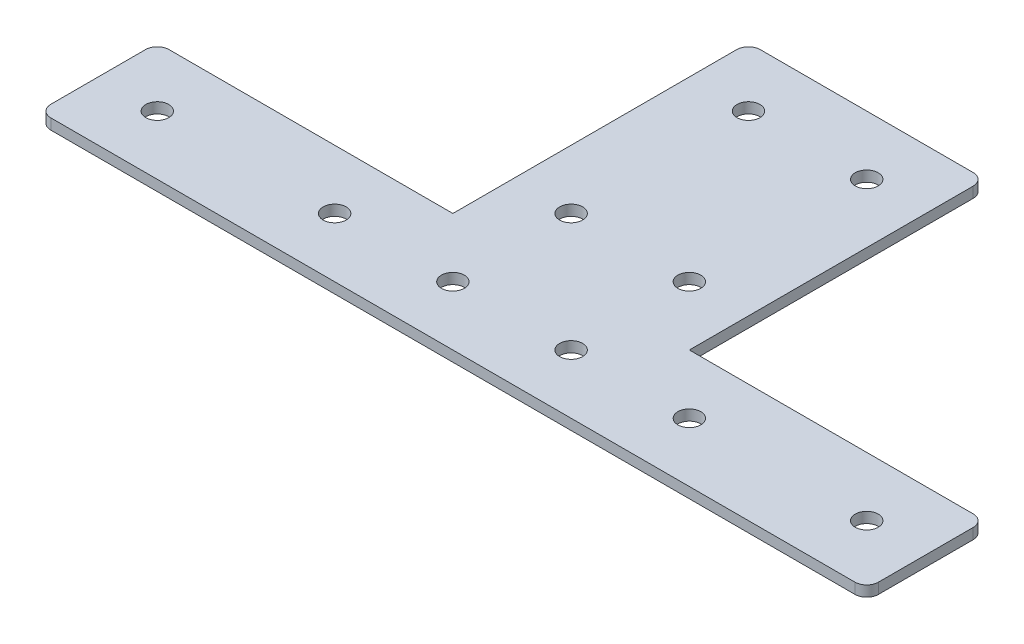
ISO-10303-21;
HEADER;
FILE_DESCRIPTION(('STEP AP214'),'2;1');
FILE_NAME('part.step','',(''),(''),'','','');
FILE_SCHEMA(('AUTOMOTIVE_DESIGN { 1 0 10303 214 1 1 1 1 }'));
ENDSEC;
DATA;
#1=APPLICATION_CONTEXT('core data for automotive mechanical design processes');
#2=APPLICATION_PROTOCOL_DEFINITION('international standard','automotive_design',2000,#1);
#3=PRODUCT_CONTEXT('',#1,'mechanical');
#4=PRODUCT('Part','Part','',(#3));
#5=PRODUCT_RELATED_PRODUCT_CATEGORY('part','',(#4));
#6=PRODUCT_DEFINITION_FORMATION('','',#4);
#7=PRODUCT_DEFINITION_CONTEXT('part definition',#1,'design');
#8=PRODUCT_DEFINITION('design','',#6,#7);
#9=PRODUCT_DEFINITION_SHAPE('','',#8);
#10=(LENGTH_UNIT() NAMED_UNIT(*) SI_UNIT(.MILLI.,.METRE.));
#11=(NAMED_UNIT(*) PLANE_ANGLE_UNIT() SI_UNIT($,.RADIAN.));
#12=(NAMED_UNIT(*) SI_UNIT($,.STERADIAN.) SOLID_ANGLE_UNIT());
#13=UNCERTAINTY_MEASURE_WITH_UNIT(LENGTH_MEASURE(1.E-05),#10,'distance_accuracy_value','');
#14=(GEOMETRIC_REPRESENTATION_CONTEXT(3) GLOBAL_UNCERTAINTY_ASSIGNED_CONTEXT((#13)) GLOBAL_UNIT_ASSIGNED_CONTEXT((#10,
#11,#12)) REPRESENTATION_CONTEXT('',''));
#15=CARTESIAN_POINT('',(0.,0.,0.));
#16=DIRECTION('',(0.,0.,1.));
#17=DIRECTION('',(1.,0.,0.));
#18=AXIS2_PLACEMENT_3D('',#15,#16,#17);
#19=CARTESIAN_POINT('',(0.,2.286,0.));
#20=DIRECTION('',(0.,0.,-1.));
#21=DIRECTION('',(-1.,0.,0.));
#22=AXIS2_PLACEMENT_3D('',#19,#20,#21);
#23=PLANE('',#22);
#24=DIRECTION('',(1.,0.,0.));
#25=VECTOR('',#24,1.);
#26=CARTESIAN_POINT('',(0.,0.,0.));
#27=LINE('',#26,#25);
#28=CARTESIAN_POINT('',(-86.36,0.,0.));
#29=VERTEX_POINT('',#28);
#30=CARTESIAN_POINT('',(86.36,0.,0.));
#31=VERTEX_POINT('',#30);
#32=EDGE_CURVE('E204',#29,#31,#27,.T.);
#33=ORIENTED_EDGE('',*,*,#32,.T.);
#34=DIRECTION('',(0.,-1.,0.));
#35=VECTOR('',#34,1.);
#36=CARTESIAN_POINT('',(86.36,2.286,0.));
#37=LINE('',#36,#35);
#38=CARTESIAN_POINT('',(86.36,2.286,0.));
#39=VERTEX_POINT('',#38);
#40=EDGE_CURVE('E53',#31,#39,#37,.F.);
#41=ORIENTED_EDGE('',*,*,#40,.T.);
#42=DIRECTION('',(1.,0.,0.));
#43=VECTOR('',#42,1.);
#44=CARTESIAN_POINT('',(0.,2.286,0.));
#45=LINE('',#44,#43);
#46=CARTESIAN_POINT('',(-86.36,2.286,0.));
#47=VERTEX_POINT('',#46);
#48=EDGE_CURVE('E207',#47,#39,#45,.T.);
#49=ORIENTED_EDGE('',*,*,#48,.F.);
#50=DIRECTION('',(0.,-1.,0.));
#51=VECTOR('',#50,1.);
#52=CARTESIAN_POINT('',(-86.36,0.,0.));
#53=LINE('',#52,#51);
#54=EDGE_CURVE('E262',#47,#29,#53,.T.);
#55=ORIENTED_EDGE('',*,*,#54,.T.);
#56=EDGE_LOOP('',(#33,#41,#49,#55));
#57=FACE_BOUND('',#56,.T.);
#58=ADVANCED_FACE('F32',(#57),#23,.F.);
#59=CARTESIAN_POINT('',(88.9,2.286,0.));
#60=DIRECTION('',(-1.,0.,0.));
#61=DIRECTION('',(0.,0.,1.));
#62=AXIS2_PLACEMENT_3D('',#59,#60,#61);
#63=PLANE('',#62);
#64=DIRECTION('',(0.,0.,-1.));
#65=VECTOR('',#64,1.);
#66=CARTESIAN_POINT('',(88.9,0.,0.));
#67=LINE('',#66,#65);
#68=CARTESIAN_POINT('',(88.9,0.,-2.54));
#69=VERTEX_POINT('',#68);
#70=CARTESIAN_POINT('',(88.9,0.,-22.86));
#71=VERTEX_POINT('',#70);
#72=EDGE_CURVE('E220',#69,#71,#67,.T.);
#73=ORIENTED_EDGE('',*,*,#72,.T.);
#74=DIRECTION('',(0.,-1.,0.));
#75=VECTOR('',#74,1.);
#76=CARTESIAN_POINT('',(88.9,2.286,-22.86));
#77=LINE('',#76,#75);
#78=CARTESIAN_POINT('',(88.9,2.286,-22.86));
#79=VERTEX_POINT('',#78);
#80=EDGE_CURVE('E249',#71,#79,#77,.F.);
#81=ORIENTED_EDGE('',*,*,#80,.T.);
#82=DIRECTION('',(0.,0.,-1.));
#83=VECTOR('',#82,1.);
#84=CARTESIAN_POINT('',(88.9,2.286,0.));
#85=LINE('',#84,#83);
#86=CARTESIAN_POINT('',(88.9,2.286,-2.54));
#87=VERTEX_POINT('',#86);
#88=EDGE_CURVE('E209',#87,#79,#85,.T.);
#89=ORIENTED_EDGE('',*,*,#88,.F.);
#90=DIRECTION('',(0.,-1.,0.));
#91=VECTOR('',#90,1.);
#92=CARTESIAN_POINT('',(88.9,2.286,-2.54));
#93=LINE('',#92,#91);
#94=EDGE_CURVE('E246',#87,#69,#93,.T.);
#95=ORIENTED_EDGE('',*,*,#94,.T.);
#96=EDGE_LOOP('',(#73,#81,#89,#95));
#97=FACE_BOUND('',#96,.T.);
#98=ADVANCED_FACE('F308',(#97),#63,.F.);
#99=CARTESIAN_POINT('',(25.4,2.286,-25.4));
#100=DIRECTION('',(0.,0.,1.));
#101=DIRECTION('',(1.,0.,0.));
#102=AXIS2_PLACEMENT_3D('',#99,#100,#101);
#103=PLANE('',#102);
#104=DIRECTION('',(-1.,0.,0.));
#105=VECTOR('',#104,1.);
#106=CARTESIAN_POINT('',(25.4,2.286,-25.4));
#107=LINE('',#106,#105);
#108=CARTESIAN_POINT('',(86.36,2.286,-25.4));
#109=VERTEX_POINT('',#108);
#110=CARTESIAN_POINT('',(25.4,2.286,-25.4));
#111=VERTEX_POINT('',#110);
#112=EDGE_CURVE('E212',#109,#111,#107,.T.);
#113=ORIENTED_EDGE('',*,*,#112,.F.);
#114=DIRECTION('',(0.,-1.,0.));
#115=VECTOR('',#114,1.);
#116=CARTESIAN_POINT('',(86.36,2.286,-25.4));
#117=LINE('',#116,#115);
#118=CARTESIAN_POINT('',(86.36,0.,-25.4));
#119=VERTEX_POINT('',#118);
#120=EDGE_CURVE('E231',#109,#119,#117,.T.);
#121=ORIENTED_EDGE('',*,*,#120,.T.);
#122=DIRECTION('',(-1.,0.,0.));
#123=VECTOR('',#122,1.);
#124=CARTESIAN_POINT('',(25.4,0.,-25.4));
#125=LINE('',#124,#123);
#126=CARTESIAN_POINT('',(25.4,0.,-25.4));
#127=VERTEX_POINT('',#126);
#128=EDGE_CURVE('E223',#119,#127,#125,.T.);
#129=ORIENTED_EDGE('',*,*,#128,.T.);
#130=DIRECTION('',(0.,-1.,0.));
#131=VECTOR('',#130,1.);
#132=CARTESIAN_POINT('',(25.4,2.286,-25.4));
#133=LINE('',#132,#131);
#134=EDGE_CURVE('E218',#111,#127,#133,.T.);
#135=ORIENTED_EDGE('',*,*,#134,.F.);
#136=EDGE_LOOP('',(#113,#121,#129,#135));
#137=FACE_BOUND('',#136,.T.);
#138=ADVANCED_FACE('F316',(#137),#103,.F.);
#139=CARTESIAN_POINT('',(25.4,2.286,-25.4));
#140=DIRECTION('',(-1.,0.,0.));
#141=DIRECTION('',(0.,0.,1.));
#142=AXIS2_PLACEMENT_3D('',#139,#140,#141);
#143=PLANE('',#142);
#144=DIRECTION('',(0.,0.,-1.));
#145=VECTOR('',#144,1.);
#146=CARTESIAN_POINT('',(25.4,0.,-25.4));
#147=LINE('',#146,#145);
#148=CARTESIAN_POINT('',(25.4,0.,-86.36));
#149=VERTEX_POINT('',#148);
#150=EDGE_CURVE('E225',#127,#149,#147,.T.);
#151=ORIENTED_EDGE('',*,*,#150,.T.);
#152=DIRECTION('',(0.,-1.,0.));
#153=VECTOR('',#152,1.);
#154=CARTESIAN_POINT('',(25.4,2.286,-86.36));
#155=LINE('',#154,#153);
#156=CARTESIAN_POINT('',(25.4,2.286,-86.36));
#157=VERTEX_POINT('',#156);
#158=EDGE_CURVE('E11',#149,#157,#155,.F.);
#159=ORIENTED_EDGE('',*,*,#158,.T.);
#160=DIRECTION('',(0.,0.,-1.));
#161=VECTOR('',#160,1.);
#162=CARTESIAN_POINT('',(25.4,2.286,-25.4));
#163=LINE('',#162,#161);
#164=EDGE_CURVE('E214',#111,#157,#163,.T.);
#165=ORIENTED_EDGE('',*,*,#164,.F.);
#166=ORIENTED_EDGE('',*,*,#134,.T.);
#167=EDGE_LOOP('',(#151,#159,#165,#166));
#168=FACE_BOUND('',#167,.T.);
#169=ADVANCED_FACE('F319',(#168),#143,.F.);
#170=CARTESIAN_POINT('',(0.,2.286,-88.9));
#171=DIRECTION('',(0.,0.,1.));
#172=DIRECTION('',(1.,0.,0.));
#173=AXIS2_PLACEMENT_3D('',#170,#171,#172);
#174=PLANE('',#173);
#175=DIRECTION('',(-1.,0.,0.));
#176=VECTOR('',#175,1.);
#177=CARTESIAN_POINT('',(0.,0.,-88.9));
#178=LINE('',#177,#176);
#179=CARTESIAN_POINT('',(22.86,0.,-88.9));
#180=VERTEX_POINT('',#179);
#181=CARTESIAN_POINT('',(-22.86,0.,-88.9));
#182=VERTEX_POINT('',#181);
#183=EDGE_CURVE('E210',#180,#182,#178,.T.);
#184=ORIENTED_EDGE('',*,*,#183,.T.);
#185=DIRECTION('',(0.,-1.,0.));
#186=VECTOR('',#185,1.);
#187=CARTESIAN_POINT('',(-22.86,2.286,-88.9));
#188=LINE('',#187,#186);
#189=CARTESIAN_POINT('',(-22.86,2.286,-88.9));
#190=VERTEX_POINT('',#189);
#191=EDGE_CURVE('E40',#182,#190,#188,.F.);
#192=ORIENTED_EDGE('',*,*,#191,.T.);
#193=DIRECTION('',(-1.,0.,0.));
#194=VECTOR('',#193,1.);
#195=CARTESIAN_POINT('',(0.,2.286,-88.9));
#196=LINE('',#195,#194);
#197=CARTESIAN_POINT('',(22.86,2.286,-88.9));
#198=VERTEX_POINT('',#197);
#199=EDGE_CURVE('E216',#198,#190,#196,.T.);
#200=ORIENTED_EDGE('',*,*,#199,.F.);
#201=DIRECTION('',(0.,-1.,0.));
#202=VECTOR('',#201,1.);
#203=CARTESIAN_POINT('',(22.86,2.286,-88.9));
#204=LINE('',#203,#202);
#205=EDGE_CURVE('E274',#198,#180,#204,.T.);
#206=ORIENTED_EDGE('',*,*,#205,.T.);
#207=EDGE_LOOP('',(#184,#192,#200,#206));
#208=FACE_BOUND('',#207,.T.);
#209=ADVANCED_FACE('F279',(#208),#174,.F.);
#210=CARTESIAN_POINT('',(0.,2.286,0.));
#211=DIRECTION('',(0.,1.,0.));
#212=DIRECTION('',(0.,0.,1.));
#213=AXIS2_PLACEMENT_3D('',#210,#211,#212);
#214=PLANE('',#213);
#215=CARTESIAN_POINT('',(-38.1,2.286,-12.7));
#216=DIRECTION('',(0.,-1.,0.));
#217=DIRECTION('',(0.,0.,1.));
#218=AXIS2_PLACEMENT_3D('',#215,#216,#217);
#219=CIRCLE('',#218,2.4638);
#220=CARTESIAN_POINT('',(-38.1,2.286,-10.2362));
#221=VERTEX_POINT('',#220);
#222=EDGE_CURVE('E589',#221,#221,#219,.T.);
#223=ORIENTED_EDGE('',*,*,#222,.T.);
#224=EDGE_LOOP('',(#223));
#225=FACE_BOUND('',#224,.T.);
#226=CARTESIAN_POINT('',(-12.7,2.286,-38.1));
#227=DIRECTION('',(0.,-1.,0.));
#228=DIRECTION('',(0.,0.,1.));
#229=AXIS2_PLACEMENT_3D('',#226,#227,#228);
#230=CIRCLE('',#229,2.4638);
#231=CARTESIAN_POINT('',(-12.7,2.286,-35.6362));
#232=VERTEX_POINT('',#231);
#233=EDGE_CURVE('E593',#232,#232,#230,.T.);
#234=ORIENTED_EDGE('',*,*,#233,.T.);
#235=EDGE_LOOP('',(#234));
#236=FACE_BOUND('',#235,.T.);
#237=CARTESIAN_POINT('',(-12.7,2.286,-76.2));
#238=DIRECTION('',(0.,-1.,0.));
#239=DIRECTION('',(0.,0.,1.));
#240=AXIS2_PLACEMENT_3D('',#237,#238,#239);
#241=CIRCLE('',#240,2.4638);
#242=CARTESIAN_POINT('',(-12.7,2.286,-73.7362));
#243=VERTEX_POINT('',#242);
#244=EDGE_CURVE('E597',#243,#243,#241,.T.);
#245=ORIENTED_EDGE('',*,*,#244,.T.);
#246=EDGE_LOOP('',(#245));
#247=FACE_BOUND('',#246,.T.);
#248=CARTESIAN_POINT('',(-12.7,2.286,-12.7));
#249=DIRECTION('',(0.,-1.,0.));
#250=DIRECTION('',(0.,0.,1.));
#251=AXIS2_PLACEMENT_3D('',#248,#249,#250);
#252=CIRCLE('',#251,2.4638);
#253=CARTESIAN_POINT('',(-12.7,2.286,-10.2362));
#254=VERTEX_POINT('',#253);
#255=EDGE_CURVE('E601',#254,#254,#252,.T.);
#256=ORIENTED_EDGE('',*,*,#255,.T.);
#257=EDGE_LOOP('',(#256));
#258=FACE_BOUND('',#257,.T.);
#259=CARTESIAN_POINT('',(-76.2,2.286,-12.7));
#260=DIRECTION('',(0.,-1.,0.));
#261=DIRECTION('',(0.,0.,1.));
#262=AXIS2_PLACEMENT_3D('',#259,#260,#261);
#263=CIRCLE('',#262,2.4638);
#264=CARTESIAN_POINT('',(-76.2,2.286,-10.2362));
#265=VERTEX_POINT('',#264);
#266=EDGE_CURVE('E169',#265,#265,#263,.T.);
#267=ORIENTED_EDGE('',*,*,#266,.T.);
#268=EDGE_LOOP('',(#267));
#269=FACE_BOUND('',#268,.T.);
#270=CARTESIAN_POINT('',(38.1,2.286,-12.7));
#271=DIRECTION('',(0.,1.,0.));
#272=DIRECTION('',(0.,0.,1.));
#273=AXIS2_PLACEMENT_3D('',#270,#271,#272);
#274=CIRCLE('',#273,2.4638);
#275=CARTESIAN_POINT('',(38.1,2.286,-10.2362));
#276=VERTEX_POINT('',#275);
#277=EDGE_CURVE('E156',#276,#276,#274,.T.);
#278=ORIENTED_EDGE('',*,*,#277,.F.);
#279=EDGE_LOOP('',(#278));
#280=FACE_BOUND('',#279,.T.);
#281=CARTESIAN_POINT('',(12.7,2.286,-38.1));
#282=DIRECTION('',(0.,1.,0.));
#283=DIRECTION('',(0.,0.,1.));
#284=AXIS2_PLACEMENT_3D('',#281,#282,#283);
#285=CIRCLE('',#284,2.4638);
#286=CARTESIAN_POINT('',(12.7,2.286,-35.6362));
#287=VERTEX_POINT('',#286);
#288=EDGE_CURVE('E181',#287,#287,#285,.T.);
#289=ORIENTED_EDGE('',*,*,#288,.F.);
#290=EDGE_LOOP('',(#289));
#291=FACE_BOUND('',#290,.T.);
#292=CARTESIAN_POINT('',(12.7,2.286,-76.2));
#293=DIRECTION('',(0.,1.,0.));
#294=DIRECTION('',(0.,0.,1.));
#295=AXIS2_PLACEMENT_3D('',#292,#293,#294);
#296=CIRCLE('',#295,2.4638);
#297=CARTESIAN_POINT('',(12.7,2.286,-73.7362));
#298=VERTEX_POINT('',#297);
#299=EDGE_CURVE('E180',#298,#298,#296,.T.);
#300=ORIENTED_EDGE('',*,*,#299,.F.);
#301=EDGE_LOOP('',(#300));
#302=FACE_BOUND('',#301,.T.);
#303=CARTESIAN_POINT('',(12.7,2.286,-12.7));
#304=DIRECTION('',(0.,1.,0.));
#305=DIRECTION('',(0.,0.,1.));
#306=AXIS2_PLACEMENT_3D('',#303,#304,#305);
#307=CIRCLE('',#306,2.4638);
#308=CARTESIAN_POINT('',(12.7,2.286,-10.2362));
#309=VERTEX_POINT('',#308);
#310=EDGE_CURVE('E193',#309,#309,#307,.T.);
#311=ORIENTED_EDGE('',*,*,#310,.F.);
#312=EDGE_LOOP('',(#311));
#313=FACE_BOUND('',#312,.T.);
#314=CARTESIAN_POINT('',(76.2,2.286,-12.7));
#315=DIRECTION('',(0.,1.,0.));
#316=DIRECTION('',(0.,0.,1.));
#317=AXIS2_PLACEMENT_3D('',#314,#315,#316);
#318=CIRCLE('',#317,2.4638);
#319=CARTESIAN_POINT('',(76.2,2.286,-10.2362));
#320=VERTEX_POINT('',#319);
#321=EDGE_CURVE('E192',#320,#320,#318,.T.);
#322=ORIENTED_EDGE('',*,*,#321,.F.);
#323=EDGE_LOOP('',(#322));
#324=FACE_BOUND('',#323,.T.);
#325=ORIENTED_EDGE('',*,*,#88,.T.);
#326=CARTESIAN_POINT('',(86.36,2.286,-22.86));
#327=DIRECTION('',(0.,1.,0.));
#328=DIRECTION('',(0.,0.,1.));
#329=AXIS2_PLACEMENT_3D('',#326,#327,#328);
#330=CIRCLE('',#329,2.54);
#331=EDGE_CURVE('E260',#79,#109,#330,.T.);
#332=ORIENTED_EDGE('',*,*,#331,.T.);
#333=ORIENTED_EDGE('',*,*,#112,.T.);
#334=ORIENTED_EDGE('',*,*,#164,.T.);
#335=CARTESIAN_POINT('',(22.86,2.286,-86.36));
#336=DIRECTION('',(0.,1.,0.));
#337=DIRECTION('',(0.,0.,1.));
#338=AXIS2_PLACEMENT_3D('',#335,#336,#337);
#339=CIRCLE('',#338,2.54);
#340=EDGE_CURVE('E251',#157,#198,#339,.T.);
#341=ORIENTED_EDGE('',*,*,#340,.T.);
#342=ORIENTED_EDGE('',*,*,#199,.T.);
#343=CARTESIAN_POINT('',(-22.86,2.286,-86.36));
#344=DIRECTION('',(0.,1.,0.));
#345=DIRECTION('',(0.,0.,1.));
#346=AXIS2_PLACEMENT_3D('',#343,#344,#345);
#347=CIRCLE('',#346,2.54);
#348=CARTESIAN_POINT('',(-25.4,2.286,-86.36));
#349=VERTEX_POINT('',#348);
#350=EDGE_CURVE('E162',#190,#349,#347,.T.);
#351=ORIENTED_EDGE('',*,*,#350,.T.);
#352=DIRECTION('',(0.,0.,-1.));
#353=VECTOR('',#352,1.);
#354=CARTESIAN_POINT('',(-25.4,2.286,-25.4));
#355=LINE('',#354,#353);
#356=CARTESIAN_POINT('',(-25.4,2.286,-25.4));
#357=VERTEX_POINT('',#356);
#358=EDGE_CURVE('E147',#357,#349,#355,.T.);
#359=ORIENTED_EDGE('',*,*,#358,.F.);
#360=DIRECTION('',(1.,0.,0.));
#361=VECTOR('',#360,1.);
#362=CARTESIAN_POINT('',(-25.4,2.286,-25.4));
#363=LINE('',#362,#361);
#364=CARTESIAN_POINT('',(-86.36,2.286,-25.4));
#365=VERTEX_POINT('',#364);
#366=EDGE_CURVE('E135',#365,#357,#363,.T.);
#367=ORIENTED_EDGE('',*,*,#366,.F.);
#368=CARTESIAN_POINT('',(-86.36,2.286,-22.86));
#369=DIRECTION('',(0.,1.,0.));
#370=DIRECTION('',(0.,0.,1.));
#371=AXIS2_PLACEMENT_3D('',#368,#369,#370);
#372=CIRCLE('',#371,2.54);
#373=CARTESIAN_POINT('',(-88.9,2.286,-22.86));
#374=VERTEX_POINT('',#373);
#375=EDGE_CURVE('E254',#365,#374,#372,.T.);
#376=ORIENTED_EDGE('',*,*,#375,.T.);
#377=DIRECTION('',(0.,0.,-1.));
#378=VECTOR('',#377,1.);
#379=CARTESIAN_POINT('',(-88.9,2.286,0.));
#380=LINE('',#379,#378);
#381=CARTESIAN_POINT('',(-88.9,2.286,-2.54));
#382=VERTEX_POINT('',#381);
#383=EDGE_CURVE('E146',#382,#374,#380,.T.);
#384=ORIENTED_EDGE('',*,*,#383,.F.);
#385=CARTESIAN_POINT('',(-86.36,2.286,-2.54));
#386=DIRECTION('',(0.,1.,0.));
#387=DIRECTION('',(0.,0.,1.));
#388=AXIS2_PLACEMENT_3D('',#385,#386,#387);
#389=CIRCLE('',#388,2.54);
#390=EDGE_CURVE('E256',#382,#47,#389,.T.);
#391=ORIENTED_EDGE('',*,*,#390,.T.);
#392=ORIENTED_EDGE('',*,*,#48,.T.);
#393=CARTESIAN_POINT('',(86.36,2.286,-2.54));
#394=DIRECTION('',(0.,1.,0.));
#395=DIRECTION('',(0.,0.,1.));
#396=AXIS2_PLACEMENT_3D('',#393,#394,#395);
#397=CIRCLE('',#396,2.54);
#398=EDGE_CURVE('E258',#39,#87,#397,.T.);
#399=ORIENTED_EDGE('',*,*,#398,.T.);
#400=EDGE_LOOP('',(#325,#332,#333,#334,#341,#342,#351,#359,#367,#376,#384,#391,#392,#399));
#401=FACE_BOUND('',#400,.T.);
#402=ADVANCED_FACE('F159',(#225,#236,#247,#258,#269,#280,#291,#302,#313,#324,#401),#214,.T.);
#403=CARTESIAN_POINT('',(0.,0.,0.));
#404=DIRECTION('',(0.,1.,0.));
#405=DIRECTION('',(0.,0.,1.));
#406=AXIS2_PLACEMENT_3D('',#403,#404,#405);
#407=PLANE('',#406);
#408=CARTESIAN_POINT('',(-38.1,0.,-12.7));
#409=DIRECTION('',(0.,-1.,0.));
#410=DIRECTION('',(0.,0.,1.));
#411=AXIS2_PLACEMENT_3D('',#408,#409,#410);
#412=CIRCLE('',#411,2.4638);
#413=CARTESIAN_POINT('',(-38.1,0.,-10.2362));
#414=VERTEX_POINT('',#413);
#415=EDGE_CURVE('E621',#414,#414,#412,.T.);
#416=ORIENTED_EDGE('',*,*,#415,.F.);
#417=EDGE_LOOP('',(#416));
#418=FACE_BOUND('',#417,.T.);
#419=CARTESIAN_POINT('',(-12.7,0.,-38.1));
#420=DIRECTION('',(0.,-1.,0.));
#421=DIRECTION('',(0.,0.,1.));
#422=AXIS2_PLACEMENT_3D('',#419,#420,#421);
#423=CIRCLE('',#422,2.4638);
#424=CARTESIAN_POINT('',(-12.7,0.,-35.6362));
#425=VERTEX_POINT('',#424);
#426=EDGE_CURVE('E617',#425,#425,#423,.T.);
#427=ORIENTED_EDGE('',*,*,#426,.F.);
#428=EDGE_LOOP('',(#427));
#429=FACE_BOUND('',#428,.T.);
#430=CARTESIAN_POINT('',(-12.7,0.,-76.2));
#431=DIRECTION('',(0.,-1.,0.));
#432=DIRECTION('',(0.,0.,1.));
#433=AXIS2_PLACEMENT_3D('',#430,#431,#432);
#434=CIRCLE('',#433,2.4638);
#435=CARTESIAN_POINT('',(-12.7,0.,-73.7362));
#436=VERTEX_POINT('',#435);
#437=EDGE_CURVE('E610',#436,#436,#434,.T.);
#438=ORIENTED_EDGE('',*,*,#437,.F.);
#439=EDGE_LOOP('',(#438));
#440=FACE_BOUND('',#439,.T.);
#441=CARTESIAN_POINT('',(-12.7,0.,-12.7));
#442=DIRECTION('',(0.,-1.,0.));
#443=DIRECTION('',(0.,0.,1.));
#444=AXIS2_PLACEMENT_3D('',#441,#442,#443);
#445=CIRCLE('',#444,2.4638);
#446=CARTESIAN_POINT('',(-12.7,0.,-10.2362));
#447=VERTEX_POINT('',#446);
#448=EDGE_CURVE('E605',#447,#447,#445,.T.);
#449=ORIENTED_EDGE('',*,*,#448,.F.);
#450=EDGE_LOOP('',(#449));
#451=FACE_BOUND('',#450,.T.);
#452=CARTESIAN_POINT('',(-76.2,0.,-12.7));
#453=DIRECTION('',(0.,-1.,0.));
#454=DIRECTION('',(0.,0.,1.));
#455=AXIS2_PLACEMENT_3D('',#452,#453,#454);
#456=CIRCLE('',#455,2.4638);
#457=CARTESIAN_POINT('',(-76.2,0.,-10.2362));
#458=VERTEX_POINT('',#457);
#459=EDGE_CURVE('E175',#458,#458,#456,.T.);
#460=ORIENTED_EDGE('',*,*,#459,.F.);
#461=EDGE_LOOP('',(#460));
#462=FACE_BOUND('',#461,.T.);
#463=CARTESIAN_POINT('',(38.1,0.,-12.7));
#464=DIRECTION('',(0.,1.,0.));
#465=DIRECTION('',(0.,0.,1.));
#466=AXIS2_PLACEMENT_3D('',#463,#464,#465);
#467=CIRCLE('',#466,2.4638);
#468=CARTESIAN_POINT('',(38.1,0.,-10.2362));
#469=VERTEX_POINT('',#468);
#470=EDGE_CURVE('E184',#469,#469,#467,.T.);
#471=ORIENTED_EDGE('',*,*,#470,.T.);
#472=EDGE_LOOP('',(#471));
#473=FACE_BOUND('',#472,.T.);
#474=CARTESIAN_POINT('',(12.7,0.,-38.1));
#475=DIRECTION('',(0.,1.,0.));
#476=DIRECTION('',(0.,0.,1.));
#477=AXIS2_PLACEMENT_3D('',#474,#475,#476);
#478=CIRCLE('',#477,2.4638);
#479=CARTESIAN_POINT('',(12.7,0.,-35.6362));
#480=VERTEX_POINT('',#479);
#481=EDGE_CURVE('E177',#480,#480,#478,.T.);
#482=ORIENTED_EDGE('',*,*,#481,.T.);
#483=EDGE_LOOP('',(#482));
#484=FACE_BOUND('',#483,.T.);
#485=CARTESIAN_POINT('',(12.7,0.,-76.2));
#486=DIRECTION('',(0.,1.,0.));
#487=DIRECTION('',(0.,0.,1.));
#488=AXIS2_PLACEMENT_3D('',#485,#486,#487);
#489=CIRCLE('',#488,2.4638);
#490=CARTESIAN_POINT('',(12.7,0.,-73.7362));
#491=VERTEX_POINT('',#490);
#492=EDGE_CURVE('E196',#491,#491,#489,.T.);
#493=ORIENTED_EDGE('',*,*,#492,.T.);
#494=EDGE_LOOP('',(#493));
#495=FACE_BOUND('',#494,.T.);
#496=CARTESIAN_POINT('',(12.7,0.,-12.7));
#497=DIRECTION('',(0.,1.,0.));
#498=DIRECTION('',(0.,0.,1.));
#499=AXIS2_PLACEMENT_3D('',#496,#497,#498);
#500=CIRCLE('',#499,2.4638);
#501=CARTESIAN_POINT('',(12.7,0.,-10.2362));
#502=VERTEX_POINT('',#501);
#503=EDGE_CURVE('E189',#502,#502,#500,.T.);
#504=ORIENTED_EDGE('',*,*,#503,.T.);
#505=EDGE_LOOP('',(#504));
#506=FACE_BOUND('',#505,.T.);
#507=CARTESIAN_POINT('',(76.2,0.,-12.7));
#508=DIRECTION('',(0.,1.,0.));
#509=DIRECTION('',(0.,0.,1.));
#510=AXIS2_PLACEMENT_3D('',#507,#508,#509);
#511=CIRCLE('',#510,2.4638);
#512=CARTESIAN_POINT('',(76.2,0.,-10.2362));
#513=VERTEX_POINT('',#512);
#514=EDGE_CURVE('E201',#513,#513,#511,.T.);
#515=ORIENTED_EDGE('',*,*,#514,.T.);
#516=EDGE_LOOP('',(#515));
#517=FACE_BOUND('',#516,.T.);
#518=ORIENTED_EDGE('',*,*,#128,.F.);
#519=CARTESIAN_POINT('',(86.36,0.,-22.86));
#520=DIRECTION('',(0.,1.,0.));
#521=DIRECTION('',(0.,0.,1.));
#522=AXIS2_PLACEMENT_3D('',#519,#520,#521);
#523=CIRCLE('',#522,2.54);
#524=EDGE_CURVE('E244',#119,#71,#523,.F.);
#525=ORIENTED_EDGE('',*,*,#524,.T.);
#526=ORIENTED_EDGE('',*,*,#72,.F.);
#527=CARTESIAN_POINT('',(86.36,0.,-2.54));
#528=DIRECTION('',(0.,1.,0.));
#529=DIRECTION('',(0.,0.,1.));
#530=AXIS2_PLACEMENT_3D('',#527,#528,#529);
#531=CIRCLE('',#530,2.54);
#532=EDGE_CURVE('E242',#69,#31,#531,.F.);
#533=ORIENTED_EDGE('',*,*,#532,.T.);
#534=ORIENTED_EDGE('',*,*,#32,.F.);
#535=CARTESIAN_POINT('',(-86.36,0.,-2.54));
#536=DIRECTION('',(0.,1.,0.));
#537=DIRECTION('',(0.,0.,1.));
#538=AXIS2_PLACEMENT_3D('',#535,#536,#537);
#539=CIRCLE('',#538,2.54);
#540=CARTESIAN_POINT('',(-88.9,0.,-2.54));
#541=VERTEX_POINT('',#540);
#542=EDGE_CURVE('E240',#29,#541,#539,.F.);
#543=ORIENTED_EDGE('',*,*,#542,.T.);
#544=DIRECTION('',(0.,0.,-1.));
#545=VECTOR('',#544,1.);
#546=CARTESIAN_POINT('',(-88.9,0.,0.));
#547=LINE('',#546,#545);
#548=CARTESIAN_POINT('',(-88.9,0.,-22.86));
#549=VERTEX_POINT('',#548);
#550=EDGE_CURVE('E163',#541,#549,#547,.T.);
#551=ORIENTED_EDGE('',*,*,#550,.T.);
#552=CARTESIAN_POINT('',(-86.36,0.,-22.86));
#553=DIRECTION('',(0.,1.,0.));
#554=DIRECTION('',(0.,0.,1.));
#555=AXIS2_PLACEMENT_3D('',#552,#553,#554);
#556=CIRCLE('',#555,2.54);
#557=CARTESIAN_POINT('',(-86.36,0.,-25.4));
#558=VERTEX_POINT('',#557);
#559=EDGE_CURVE('E238',#549,#558,#556,.F.);
#560=ORIENTED_EDGE('',*,*,#559,.T.);
#561=DIRECTION('',(1.,0.,0.));
#562=VECTOR('',#561,1.);
#563=CARTESIAN_POINT('',(-25.4,0.,-25.4));
#564=LINE('',#563,#562);
#565=CARTESIAN_POINT('',(-25.4,0.,-25.4));
#566=VERTEX_POINT('',#565);
#567=EDGE_CURVE('E166',#558,#566,#564,.T.);
#568=ORIENTED_EDGE('',*,*,#567,.T.);
#569=DIRECTION('',(0.,0.,-1.));
#570=VECTOR('',#569,1.);
#571=CARTESIAN_POINT('',(-25.4,0.,-25.4));
#572=LINE('',#571,#570);
#573=CARTESIAN_POINT('',(-25.4,0.,-86.36));
#574=VERTEX_POINT('',#573);
#575=EDGE_CURVE('E155',#566,#574,#572,.T.);
#576=ORIENTED_EDGE('',*,*,#575,.T.);
#577=CARTESIAN_POINT('',(-22.86,0.,-86.36));
#578=DIRECTION('',(0.,1.,0.));
#579=DIRECTION('',(0.,0.,1.));
#580=AXIS2_PLACEMENT_3D('',#577,#578,#579);
#581=CIRCLE('',#580,2.54);
#582=EDGE_CURVE('E236',#574,#182,#581,.F.);
#583=ORIENTED_EDGE('',*,*,#582,.T.);
#584=ORIENTED_EDGE('',*,*,#183,.F.);
#585=CARTESIAN_POINT('',(22.86,0.,-86.36));
#586=DIRECTION('',(0.,1.,0.));
#587=DIRECTION('',(0.,0.,1.));
#588=AXIS2_PLACEMENT_3D('',#585,#586,#587);
#589=CIRCLE('',#588,2.54);
#590=EDGE_CURVE('E234',#180,#149,#589,.F.);
#591=ORIENTED_EDGE('',*,*,#590,.T.);
#592=ORIENTED_EDGE('',*,*,#150,.F.);
#593=EDGE_LOOP('',(#518,#525,#526,#533,#534,#543,#551,#560,#568,#576,#583,#584,#591,#592));
#594=FACE_BOUND('',#593,.T.);
#595=ADVANCED_FACE('F287',(#418,#429,#440,#451,#462,#473,#484,#495,#506,#517,#594),#407,.F.);
#596=CARTESIAN_POINT('',(76.2,0.,-12.7));
#597=DIRECTION('',(0.,1.,0.));
#598=DIRECTION('',(0.,0.,1.));
#599=AXIS2_PLACEMENT_3D('',#596,#597,#598);
#600=CYLINDRICAL_SURFACE('',#599,2.4638);
#601=ORIENTED_EDGE('',*,*,#514,.F.);
#602=EDGE_LOOP('',(#601));
#603=FACE_BOUND('',#602,.T.);
#604=ORIENTED_EDGE('',*,*,#321,.T.);
#605=EDGE_LOOP('',(#604));
#606=FACE_BOUND('',#605,.T.);
#607=ADVANCED_FACE('F447',(#603,#606),#600,.F.);
#608=CARTESIAN_POINT('',(12.7,0.,-12.7));
#609=DIRECTION('',(0.,1.,0.));
#610=DIRECTION('',(0.,0.,1.));
#611=AXIS2_PLACEMENT_3D('',#608,#609,#610);
#612=CYLINDRICAL_SURFACE('',#611,2.4638);
#613=ORIENTED_EDGE('',*,*,#503,.F.);
#614=EDGE_LOOP('',(#613));
#615=FACE_BOUND('',#614,.T.);
#616=ORIENTED_EDGE('',*,*,#310,.T.);
#617=EDGE_LOOP('',(#616));
#618=FACE_BOUND('',#617,.T.);
#619=ADVANCED_FACE('F508',(#615,#618),#612,.F.);
#620=CARTESIAN_POINT('',(12.7,0.,-76.2));
#621=DIRECTION('',(0.,1.,0.));
#622=DIRECTION('',(0.,0.,1.));
#623=AXIS2_PLACEMENT_3D('',#620,#621,#622);
#624=CYLINDRICAL_SURFACE('',#623,2.4638);
#625=ORIENTED_EDGE('',*,*,#492,.F.);
#626=EDGE_LOOP('',(#625));
#627=FACE_BOUND('',#626,.T.);
#628=ORIENTED_EDGE('',*,*,#299,.T.);
#629=EDGE_LOOP('',(#628));
#630=FACE_BOUND('',#629,.T.);
#631=ADVANCED_FACE('F499',(#627,#630),#624,.F.);
#632=CARTESIAN_POINT('',(12.7,0.,-38.1));
#633=DIRECTION('',(0.,1.,0.));
#634=DIRECTION('',(0.,0.,1.));
#635=AXIS2_PLACEMENT_3D('',#632,#633,#634);
#636=CYLINDRICAL_SURFACE('',#635,2.4638);
#637=ORIENTED_EDGE('',*,*,#481,.F.);
#638=EDGE_LOOP('',(#637));
#639=FACE_BOUND('',#638,.T.);
#640=ORIENTED_EDGE('',*,*,#288,.T.);
#641=EDGE_LOOP('',(#640));
#642=FACE_BOUND('',#641,.T.);
#643=ADVANCED_FACE('F490',(#639,#642),#636,.F.);
#644=CARTESIAN_POINT('',(38.1,0.,-12.7));
#645=DIRECTION('',(0.,1.,0.));
#646=DIRECTION('',(0.,0.,1.));
#647=AXIS2_PLACEMENT_3D('',#644,#645,#646);
#648=CYLINDRICAL_SURFACE('',#647,2.4638);
#649=ORIENTED_EDGE('',*,*,#470,.F.);
#650=EDGE_LOOP('',(#649));
#651=FACE_BOUND('',#650,.T.);
#652=ORIENTED_EDGE('',*,*,#277,.T.);
#653=EDGE_LOOP('',(#652));
#654=FACE_BOUND('',#653,.T.);
#655=ADVANCED_FACE('F438',(#651,#654),#648,.F.);
#656=CARTESIAN_POINT('',(-25.4,2.286,-25.4));
#657=DIRECTION('',(-1.,0.,0.));
#658=DIRECTION('',(0.,0.,1.));
#659=AXIS2_PLACEMENT_3D('',#656,#657,#658);
#660=PLANE('',#659);
#661=ORIENTED_EDGE('',*,*,#358,.T.);
#662=DIRECTION('',(0.,-1.,0.));
#663=VECTOR('',#662,1.);
#664=CARTESIAN_POINT('',(-25.4,0.,-86.36));
#665=LINE('',#664,#663);
#666=EDGE_CURVE('E272',#349,#574,#665,.T.);
#667=ORIENTED_EDGE('',*,*,#666,.T.);
#668=ORIENTED_EDGE('',*,*,#575,.F.);
#669=DIRECTION('',(0.,-1.,0.));
#670=VECTOR('',#669,1.);
#671=CARTESIAN_POINT('',(-25.4,2.286,-25.4));
#672=LINE('',#671,#670);
#673=EDGE_CURVE('E139',#357,#566,#672,.T.);
#674=ORIENTED_EDGE('',*,*,#673,.F.);
#675=EDGE_LOOP('',(#661,#667,#668,#674));
#676=FACE_BOUND('',#675,.T.);
#677=ADVANCED_FACE('F151',(#676),#660,.T.);
#678=CARTESIAN_POINT('',(-25.4,2.286,-25.4));
#679=DIRECTION('',(0.,0.,-1.));
#680=DIRECTION('',(-1.,0.,0.));
#681=AXIS2_PLACEMENT_3D('',#678,#679,#680);
#682=PLANE('',#681);
#683=ORIENTED_EDGE('',*,*,#567,.F.);
#684=DIRECTION('',(0.,-1.,0.));
#685=VECTOR('',#684,1.);
#686=CARTESIAN_POINT('',(-86.36,2.286,-25.4));
#687=LINE('',#686,#685);
#688=EDGE_CURVE('E142',#558,#365,#687,.F.);
#689=ORIENTED_EDGE('',*,*,#688,.T.);
#690=ORIENTED_EDGE('',*,*,#366,.T.);
#691=ORIENTED_EDGE('',*,*,#673,.T.);
#692=EDGE_LOOP('',(#683,#689,#690,#691));
#693=FACE_BOUND('',#692,.T.);
#694=ADVANCED_FACE('F138',(#693),#682,.T.);
#695=CARTESIAN_POINT('',(-88.9,2.286,0.));
#696=DIRECTION('',(-1.,0.,0.));
#697=DIRECTION('',(0.,0.,1.));
#698=AXIS2_PLACEMENT_3D('',#695,#696,#697);
#699=PLANE('',#698);
#700=ORIENTED_EDGE('',*,*,#550,.F.);
#701=DIRECTION('',(0.,-1.,0.));
#702=VECTOR('',#701,1.);
#703=CARTESIAN_POINT('',(-88.9,2.286,-2.54));
#704=LINE('',#703,#702);
#705=EDGE_CURVE('E269',#541,#382,#704,.F.);
#706=ORIENTED_EDGE('',*,*,#705,.T.);
#707=ORIENTED_EDGE('',*,*,#383,.T.);
#708=DIRECTION('',(0.,-1.,0.));
#709=VECTOR('',#708,1.);
#710=CARTESIAN_POINT('',(-88.9,2.286,-22.86));
#711=LINE('',#710,#709);
#712=EDGE_CURVE('E266',#374,#549,#711,.T.);
#713=ORIENTED_EDGE('',*,*,#712,.T.);
#714=EDGE_LOOP('',(#700,#706,#707,#713));
#715=FACE_BOUND('',#714,.T.);
#716=ADVANCED_FACE('F295',(#715),#699,.T.);
#717=CARTESIAN_POINT('',(-76.2,0.,-12.7));
#718=DIRECTION('',(0.,1.,0.));
#719=DIRECTION('',(0.,0.,1.));
#720=AXIS2_PLACEMENT_3D('',#717,#718,#719);
#721=CYLINDRICAL_SURFACE('',#720,2.4638);
#722=ORIENTED_EDGE('',*,*,#459,.T.);
#723=EDGE_LOOP('',(#722));
#724=FACE_BOUND('',#723,.T.);
#725=ORIENTED_EDGE('',*,*,#266,.F.);
#726=EDGE_LOOP('',(#725));
#727=FACE_BOUND('',#726,.T.);
#728=ADVANCED_FACE('F407',(#724,#727),#721,.F.);
#729=CARTESIAN_POINT('',(-12.7,0.,-12.7));
#730=DIRECTION('',(0.,1.,0.));
#731=DIRECTION('',(0.,0.,1.));
#732=AXIS2_PLACEMENT_3D('',#729,#730,#731);
#733=CYLINDRICAL_SURFACE('',#732,2.4638);
#734=ORIENTED_EDGE('',*,*,#448,.T.);
#735=EDGE_LOOP('',(#734));
#736=FACE_BOUND('',#735,.T.);
#737=ORIENTED_EDGE('',*,*,#255,.F.);
#738=EDGE_LOOP('',(#737));
#739=FACE_BOUND('',#738,.T.);
#740=ADVANCED_FACE('F398',(#736,#739),#733,.F.);
#741=CARTESIAN_POINT('',(-12.7,0.,-76.2));
#742=DIRECTION('',(0.,1.,0.));
#743=DIRECTION('',(0.,0.,1.));
#744=AXIS2_PLACEMENT_3D('',#741,#742,#743);
#745=CYLINDRICAL_SURFACE('',#744,2.4638);
#746=ORIENTED_EDGE('',*,*,#437,.T.);
#747=EDGE_LOOP('',(#746));
#748=FACE_BOUND('',#747,.T.);
#749=ORIENTED_EDGE('',*,*,#244,.F.);
#750=EDGE_LOOP('',(#749));
#751=FACE_BOUND('',#750,.T.);
#752=ADVANCED_FACE('F389',(#748,#751),#745,.F.);
#753=CARTESIAN_POINT('',(-12.7,0.,-38.1));
#754=DIRECTION('',(0.,1.,0.));
#755=DIRECTION('',(0.,0.,1.));
#756=AXIS2_PLACEMENT_3D('',#753,#754,#755);
#757=CYLINDRICAL_SURFACE('',#756,2.4638);
#758=ORIENTED_EDGE('',*,*,#426,.T.);
#759=EDGE_LOOP('',(#758));
#760=FACE_BOUND('',#759,.T.);
#761=ORIENTED_EDGE('',*,*,#233,.F.);
#762=EDGE_LOOP('',(#761));
#763=FACE_BOUND('',#762,.T.);
#764=ADVANCED_FACE('F380',(#760,#763),#757,.F.);
#765=CARTESIAN_POINT('',(-38.1,0.,-12.7));
#766=DIRECTION('',(0.,1.,0.));
#767=DIRECTION('',(0.,0.,1.));
#768=AXIS2_PLACEMENT_3D('',#765,#766,#767);
#769=CYLINDRICAL_SURFACE('',#768,2.4638);
#770=ORIENTED_EDGE('',*,*,#415,.T.);
#771=EDGE_LOOP('',(#770));
#772=FACE_BOUND('',#771,.T.);
#773=ORIENTED_EDGE('',*,*,#222,.F.);
#774=EDGE_LOOP('',(#773));
#775=FACE_BOUND('',#774,.T.);
#776=ADVANCED_FACE('F335',(#772,#775),#769,.F.);
#777=CARTESIAN_POINT('',(86.36,2.286,-22.86));
#778=DIRECTION('',(0.,-1.,0.));
#779=DIRECTION('',(0.,0.,-1.));
#780=AXIS2_PLACEMENT_3D('',#777,#778,#779);
#781=CYLINDRICAL_SURFACE('',#780,2.54);
#782=ORIENTED_EDGE('',*,*,#331,.F.);
#783=ORIENTED_EDGE('',*,*,#80,.F.);
#784=ORIENTED_EDGE('',*,*,#524,.F.);
#785=ORIENTED_EDGE('',*,*,#120,.F.);
#786=EDGE_LOOP('',(#782,#783,#784,#785));
#787=FACE_BOUND('',#786,.T.);
#788=ADVANCED_FACE('F314',(#787),#781,.T.);
#789=CARTESIAN_POINT('',(86.36,2.286,-2.54));
#790=DIRECTION('',(0.,-1.,0.));
#791=DIRECTION('',(0.,0.,-1.));
#792=AXIS2_PLACEMENT_3D('',#789,#790,#791);
#793=CYLINDRICAL_SURFACE('',#792,2.54);
#794=ORIENTED_EDGE('',*,*,#398,.F.);
#795=ORIENTED_EDGE('',*,*,#40,.F.);
#796=ORIENTED_EDGE('',*,*,#532,.F.);
#797=ORIENTED_EDGE('',*,*,#94,.F.);
#798=EDGE_LOOP('',(#794,#795,#796,#797));
#799=FACE_BOUND('',#798,.T.);
#800=ADVANCED_FACE('F305',(#799),#793,.T.);
#801=CARTESIAN_POINT('',(-86.36,2.286,-2.54));
#802=DIRECTION('',(0.,1.,0.));
#803=DIRECTION('',(0.,0.,1.));
#804=AXIS2_PLACEMENT_3D('',#801,#802,#803);
#805=CYLINDRICAL_SURFACE('',#804,2.54);
#806=ORIENTED_EDGE('',*,*,#390,.F.);
#807=ORIENTED_EDGE('',*,*,#705,.F.);
#808=ORIENTED_EDGE('',*,*,#542,.F.);
#809=ORIENTED_EDGE('',*,*,#54,.F.);
#810=EDGE_LOOP('',(#806,#807,#808,#809));
#811=FACE_BOUND('',#810,.T.);
#812=ADVANCED_FACE('F298',(#811),#805,.T.);
#813=CARTESIAN_POINT('',(-86.36,2.286,-22.86));
#814=DIRECTION('',(0.,-1.,0.));
#815=DIRECTION('',(0.,0.,-1.));
#816=AXIS2_PLACEMENT_3D('',#813,#814,#815);
#817=CYLINDRICAL_SURFACE('',#816,2.54);
#818=ORIENTED_EDGE('',*,*,#375,.F.);
#819=ORIENTED_EDGE('',*,*,#688,.F.);
#820=ORIENTED_EDGE('',*,*,#559,.F.);
#821=ORIENTED_EDGE('',*,*,#712,.F.);
#822=EDGE_LOOP('',(#818,#819,#820,#821));
#823=FACE_BOUND('',#822,.T.);
#824=ADVANCED_FACE('F289',(#823),#817,.T.);
#825=CARTESIAN_POINT('',(-22.86,2.286,-86.36));
#826=DIRECTION('',(0.,1.,0.));
#827=DIRECTION('',(0.,0.,1.));
#828=AXIS2_PLACEMENT_3D('',#825,#826,#827);
#829=CYLINDRICAL_SURFACE('',#828,2.54);
#830=ORIENTED_EDGE('',*,*,#350,.F.);
#831=ORIENTED_EDGE('',*,*,#191,.F.);
#832=ORIENTED_EDGE('',*,*,#582,.F.);
#833=ORIENTED_EDGE('',*,*,#666,.F.);
#834=EDGE_LOOP('',(#830,#831,#832,#833));
#835=FACE_BOUND('',#834,.T.);
#836=ADVANCED_FACE('F284',(#835),#829,.T.);
#837=CARTESIAN_POINT('',(22.86,2.286,-86.36));
#838=DIRECTION('',(0.,-1.,0.));
#839=DIRECTION('',(0.,0.,-1.));
#840=AXIS2_PLACEMENT_3D('',#837,#838,#839);
#841=CYLINDRICAL_SURFACE('',#840,2.54);
#842=ORIENTED_EDGE('',*,*,#340,.F.);
#843=ORIENTED_EDGE('',*,*,#158,.F.);
#844=ORIENTED_EDGE('',*,*,#590,.F.);
#845=ORIENTED_EDGE('',*,*,#205,.F.);
#846=EDGE_LOOP('',(#842,#843,#844,#845));
#847=FACE_BOUND('',#846,.T.);
#848=ADVANCED_FACE('F34',(#847),#841,.T.);
#849=CLOSED_SHELL('',(#58,#98,#138,#169,#209,#402,#595,#607,#619,#631,#643,#655,#677,#694,#716,
#728,#740,#752,#764,#776,#788,#800,#812,#824,#836,#848));
#850=MANIFOLD_SOLID_BREP('B2',#849);
#851=ADVANCED_BREP_SHAPE_REPRESENTATION('',(#18,#850),#14);
#852=SHAPE_DEFINITION_REPRESENTATION(#9,#851);
ENDSEC;
END-ISO-10303-21;
